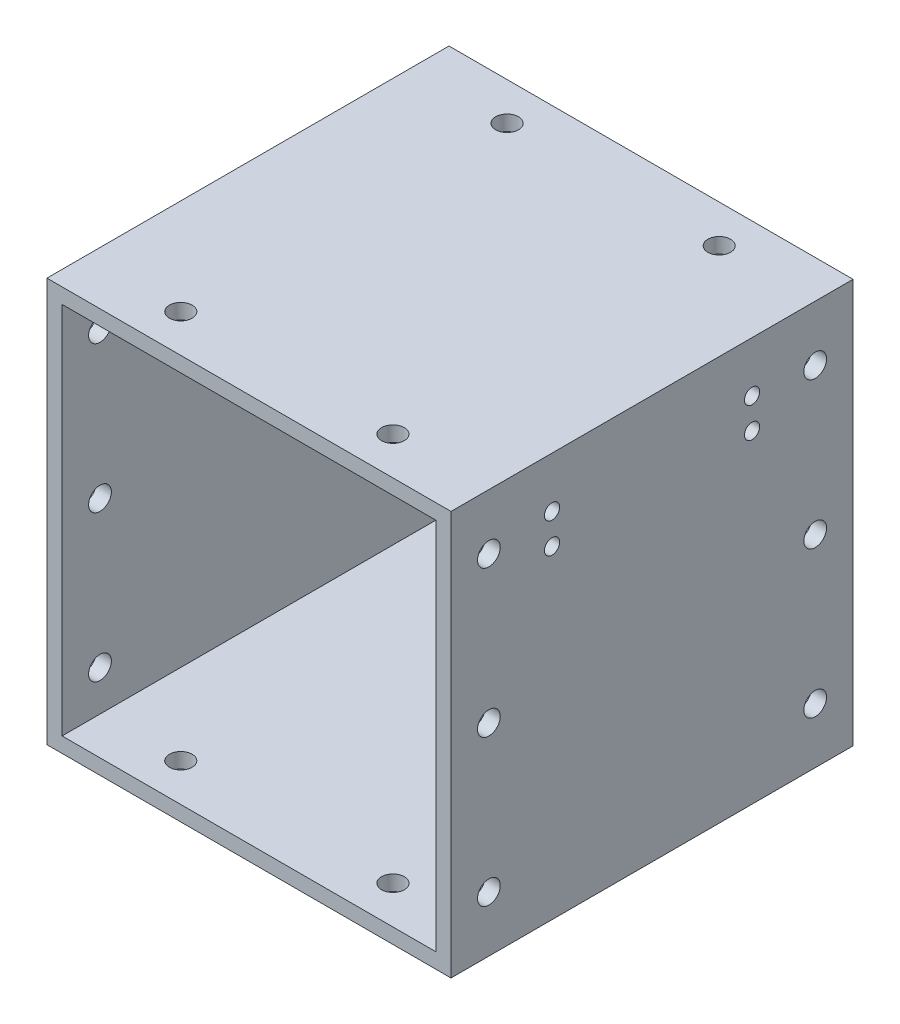
ISO-10303-21;
HEADER;
FILE_DESCRIPTION(('STEP AP214'),'2;1');
FILE_NAME('part.step','',(''),(''),'','','');
FILE_SCHEMA(('AUTOMOTIVE_DESIGN { 1 0 10303 214 1 1 1 1 }'));
ENDSEC;
DATA;
#1=APPLICATION_CONTEXT('core data for automotive mechanical design processes');
#2=APPLICATION_PROTOCOL_DEFINITION('international standard','automotive_design',2000,#1);
#3=PRODUCT_CONTEXT('',#1,'mechanical');
#4=PRODUCT('Part','Part','',(#3));
#5=PRODUCT_RELATED_PRODUCT_CATEGORY('part','',(#4));
#6=PRODUCT_DEFINITION_FORMATION('','',#4);
#7=PRODUCT_DEFINITION_CONTEXT('part definition',#1,'design');
#8=PRODUCT_DEFINITION('design','',#6,#7);
#9=PRODUCT_DEFINITION_SHAPE('','',#8);
#10=(LENGTH_UNIT() NAMED_UNIT(*) SI_UNIT(.MILLI.,.METRE.));
#11=(NAMED_UNIT(*) PLANE_ANGLE_UNIT() SI_UNIT($,.RADIAN.));
#12=(NAMED_UNIT(*) SI_UNIT($,.STERADIAN.) SOLID_ANGLE_UNIT());
#13=UNCERTAINTY_MEASURE_WITH_UNIT(LENGTH_MEASURE(1.E-05),#10,'distance_accuracy_value','');
#14=(GEOMETRIC_REPRESENTATION_CONTEXT(3) GLOBAL_UNCERTAINTY_ASSIGNED_CONTEXT((#13)) GLOBAL_UNIT_ASSIGNED_CONTEXT((#10,
#11,#12)) REPRESENTATION_CONTEXT('',''));
#15=CARTESIAN_POINT('',(0.,0.,0.));
#16=DIRECTION('',(0.,0.,1.));
#17=DIRECTION('',(1.,0.,0.));
#18=AXIS2_PLACEMENT_3D('',#15,#16,#17);
#19=CARTESIAN_POINT('',(40.,-40.,136.6));
#20=DIRECTION('',(-1.,0.,0.));
#21=DIRECTION('',(0.,0.,1.));
#22=AXIS2_PLACEMENT_3D('',#19,#20,#21);
#23=PLANE('',#22);
#24=CARTESIAN_POINT('',(40.,29.,64.5));
#25=DIRECTION('',(1.,0.,0.));
#26=DIRECTION('',(0.,0.,-1.));
#27=AXIS2_PLACEMENT_3D('',#24,#25,#26);
#28=CIRCLE('',#27,2.25);
#29=CARTESIAN_POINT('',(40.,29.,62.25));
#30=VERTEX_POINT('',#29);
#31=EDGE_CURVE('E412',#30,#30,#28,.T.);
#32=ORIENTED_EDGE('',*,*,#31,.F.);
#33=EDGE_LOOP('',(#32));
#34=FACE_BOUND('',#33,.T.);
#35=DIRECTION('',(0.,1.,0.));
#36=VECTOR('',#35,1.);
#37=CARTESIAN_POINT('',(40.,-40.,57.));
#38=LINE('',#37,#36);
#39=CARTESIAN_POINT('',(40.,-40.,57.));
#40=VERTEX_POINT('',#39);
#41=CARTESIAN_POINT('',(40.,40.,57.));
#42=VERTEX_POINT('',#41);
#43=EDGE_CURVE('E137',#40,#42,#38,.T.);
#44=ORIENTED_EDGE('',*,*,#43,.T.);
#45=DIRECTION('',(0.,0.,-1.));
#46=VECTOR('',#45,1.);
#47=CARTESIAN_POINT('',(40.,40.,136.6));
#48=LINE('',#47,#46);
#49=CARTESIAN_POINT('',(40.,40.,136.6));
#50=VERTEX_POINT('',#49);
#51=EDGE_CURVE('E11',#50,#42,#48,.T.);
#52=ORIENTED_EDGE('',*,*,#51,.F.);
#53=DIRECTION('',(0.,1.,0.));
#54=VECTOR('',#53,1.);
#55=CARTESIAN_POINT('',(40.,-40.,136.6));
#56=LINE('',#55,#54);
#57=CARTESIAN_POINT('',(40.,-40.,136.6));
#58=VERTEX_POINT('',#57);
#59=EDGE_CURVE('E172',#58,#50,#56,.T.);
#60=ORIENTED_EDGE('',*,*,#59,.F.);
#61=DIRECTION('',(0.,0.,-1.));
#62=VECTOR('',#61,1.);
#63=CARTESIAN_POINT('',(40.,-40.,136.6));
#64=LINE('',#63,#62);
#65=EDGE_CURVE('E186',#58,#40,#64,.T.);
#66=ORIENTED_EDGE('',*,*,#65,.T.);
#67=EDGE_LOOP('',(#44,#52,#60,#66));
#68=FACE_BOUND('',#67,.T.);
#69=CARTESIAN_POINT('',(40.,-29.,129.1));
#70=DIRECTION('',(1.,0.,0.));
#71=DIRECTION('',(0.,0.,-1.));
#72=AXIS2_PLACEMENT_3D('',#69,#70,#71);
#73=CIRCLE('',#72,2.25);
#74=CARTESIAN_POINT('',(40.,-29.,126.85));
#75=VERTEX_POINT('',#74);
#76=EDGE_CURVE('E322',#75,#75,#73,.T.);
#77=ORIENTED_EDGE('',*,*,#76,.F.);
#78=EDGE_LOOP('',(#77));
#79=FACE_BOUND('',#78,.T.);
#80=CARTESIAN_POINT('',(40.,0.,129.1));
#81=DIRECTION('',(1.,0.,0.));
#82=DIRECTION('',(0.,0.,-1.));
#83=AXIS2_PLACEMENT_3D('',#80,#81,#82);
#84=CIRCLE('',#83,2.25);
#85=CARTESIAN_POINT('',(40.,0.,126.85));
#86=VERTEX_POINT('',#85);
#87=EDGE_CURVE('E314',#86,#86,#84,.T.);
#88=ORIENTED_EDGE('',*,*,#87,.F.);
#89=EDGE_LOOP('',(#88));
#90=FACE_BOUND('',#89,.T.);
#91=CARTESIAN_POINT('',(40.,29.,129.1));
#92=DIRECTION('',(1.,0.,0.));
#93=DIRECTION('',(0.,0.,-1.));
#94=AXIS2_PLACEMENT_3D('',#91,#92,#93);
#95=CIRCLE('',#94,2.25);
#96=CARTESIAN_POINT('',(40.,29.,126.85));
#97=VERTEX_POINT('',#96);
#98=EDGE_CURVE('E306',#97,#97,#95,.T.);
#99=ORIENTED_EDGE('',*,*,#98,.F.);
#100=EDGE_LOOP('',(#99));
#101=FACE_BOUND('',#100,.T.);
#102=CARTESIAN_POINT('',(40.,0.,64.5));
#103=DIRECTION('',(1.,0.,0.));
#104=DIRECTION('',(0.,0.,-1.));
#105=AXIS2_PLACEMENT_3D('',#102,#103,#104);
#106=CIRCLE('',#105,2.25);
#107=CARTESIAN_POINT('',(40.,0.,62.25));
#108=VERTEX_POINT('',#107);
#109=EDGE_CURVE('E256',#108,#108,#106,.T.);
#110=ORIENTED_EDGE('',*,*,#109,.F.);
#111=EDGE_LOOP('',(#110));
#112=FACE_BOUND('',#111,.T.);
#113=CARTESIAN_POINT('',(40.,-29.,64.5));
#114=DIRECTION('',(1.,0.,0.));
#115=DIRECTION('',(0.,0.,-1.));
#116=AXIS2_PLACEMENT_3D('',#113,#114,#115);
#117=CIRCLE('',#116,2.25);
#118=CARTESIAN_POINT('',(40.,-29.,62.25));
#119=VERTEX_POINT('',#118);
#120=EDGE_CURVE('E422',#119,#119,#117,.T.);
#121=ORIENTED_EDGE('',*,*,#120,.F.);
#122=EDGE_LOOP('',(#121));
#123=FACE_BOUND('',#122,.T.);
#124=CARTESIAN_POINT('',(40.,30.,77.));
#125=DIRECTION('',(1.,0.,0.));
#126=DIRECTION('',(0.,0.,-1.));
#127=AXIS2_PLACEMENT_3D('',#124,#125,#126);
#128=CIRCLE('',#127,1.49999999999999);
#129=CARTESIAN_POINT('',(40.,30.,75.5));
#130=VERTEX_POINT('',#129);
#131=EDGE_CURVE('E425',#130,#130,#128,.T.);
#132=ORIENTED_EDGE('',*,*,#131,.F.);
#133=EDGE_LOOP('',(#132));
#134=FACE_BOUND('',#133,.T.);
#135=CARTESIAN_POINT('',(40.,24.,77.));
#136=DIRECTION('',(1.,0.,0.));
#137=DIRECTION('',(0.,0.,-1.));
#138=AXIS2_PLACEMENT_3D('',#135,#136,#137);
#139=CIRCLE('',#138,1.49999999999999);
#140=CARTESIAN_POINT('',(40.,24.,75.5));
#141=VERTEX_POINT('',#140);
#142=EDGE_CURVE('E453',#141,#141,#139,.T.);
#143=ORIENTED_EDGE('',*,*,#142,.F.);
#144=EDGE_LOOP('',(#143));
#145=FACE_BOUND('',#144,.T.);
#146=CARTESIAN_POINT('',(40.,30.,116.6));
#147=DIRECTION('',(1.,0.,0.));
#148=DIRECTION('',(0.,0.,-1.));
#149=AXIS2_PLACEMENT_3D('',#146,#147,#148);
#150=CIRCLE('',#149,1.49999999999999);
#151=CARTESIAN_POINT('',(40.,30.,115.1));
#152=VERTEX_POINT('',#151);
#153=EDGE_CURVE('E457',#152,#152,#150,.T.);
#154=ORIENTED_EDGE('',*,*,#153,.F.);
#155=EDGE_LOOP('',(#154));
#156=FACE_BOUND('',#155,.T.);
#157=CARTESIAN_POINT('',(40.,24.,116.6));
#158=DIRECTION('',(1.,0.,0.));
#159=DIRECTION('',(0.,0.,-1.));
#160=AXIS2_PLACEMENT_3D('',#157,#158,#159);
#161=CIRCLE('',#160,1.49999999999999);
#162=CARTESIAN_POINT('',(40.,24.,115.1));
#163=VERTEX_POINT('',#162);
#164=EDGE_CURVE('E460',#163,#163,#161,.T.);
#165=ORIENTED_EDGE('',*,*,#164,.F.);
#166=EDGE_LOOP('',(#165));
#167=FACE_BOUND('',#166,.T.);
#168=ADVANCED_FACE('F51',(#34,#68,#79,#90,#101,#112,#123,#134,#145,#156,#167),#23,.F.);
#169=CARTESIAN_POINT('',(-40.,40.,136.6));
#170=DIRECTION('',(0.,-1.,0.));
#171=DIRECTION('',(0.,0.,-1.));
#172=AXIS2_PLACEMENT_3D('',#169,#170,#171);
#173=PLANE('',#172);
#174=CARTESIAN_POINT('',(-21.,40.,129.1));
#175=DIRECTION('',(0.,1.,0.));
#176=DIRECTION('',(0.,0.,1.));
#177=AXIS2_PLACEMENT_3D('',#174,#175,#176);
#178=CIRCLE('',#177,2.25);
#179=CARTESIAN_POINT('',(-21.,40.,131.35));
#180=VERTEX_POINT('',#179);
#181=EDGE_CURVE('E330',#180,#180,#178,.T.);
#182=ORIENTED_EDGE('',*,*,#181,.F.);
#183=EDGE_LOOP('',(#182));
#184=FACE_BOUND('',#183,.T.);
#185=DIRECTION('',(-1.,0.,0.));
#186=VECTOR('',#185,1.);
#187=CARTESIAN_POINT('',(-40.,40.,57.));
#188=LINE('',#187,#186);
#189=CARTESIAN_POINT('',(-40.,40.,57.));
#190=VERTEX_POINT('',#189);
#191=EDGE_CURVE('E190',#42,#190,#188,.T.);
#192=ORIENTED_EDGE('',*,*,#191,.T.);
#193=DIRECTION('',(0.,0.,-1.));
#194=VECTOR('',#193,1.);
#195=CARTESIAN_POINT('',(-40.,40.,136.6));
#196=LINE('',#195,#194);
#197=CARTESIAN_POINT('',(-40.,40.,136.6));
#198=VERTEX_POINT('',#197);
#199=EDGE_CURVE('E59',#198,#190,#196,.T.);
#200=ORIENTED_EDGE('',*,*,#199,.F.);
#201=DIRECTION('',(-1.,0.,0.));
#202=VECTOR('',#201,1.);
#203=CARTESIAN_POINT('',(-40.,40.,136.6));
#204=LINE('',#203,#202);
#205=EDGE_CURVE('E176',#50,#198,#204,.T.);
#206=ORIENTED_EDGE('',*,*,#205,.F.);
#207=ORIENTED_EDGE('',*,*,#51,.T.);
#208=EDGE_LOOP('',(#192,#200,#206,#207));
#209=FACE_BOUND('',#208,.T.);
#210=CARTESIAN_POINT('',(21.,40.,129.1));
#211=DIRECTION('',(0.,1.,0.));
#212=DIRECTION('',(0.,0.,1.));
#213=AXIS2_PLACEMENT_3D('',#210,#211,#212);
#214=CIRCLE('',#213,2.25);
#215=CARTESIAN_POINT('',(21.,40.,131.35));
#216=VERTEX_POINT('',#215);
#217=EDGE_CURVE('E237',#216,#216,#214,.T.);
#218=ORIENTED_EDGE('',*,*,#217,.F.);
#219=EDGE_LOOP('',(#218));
#220=FACE_BOUND('',#219,.T.);
#221=CARTESIAN_POINT('',(-21.,40.,64.5));
#222=DIRECTION('',(0.,1.,0.));
#223=DIRECTION('',(0.,0.,1.));
#224=AXIS2_PLACEMENT_3D('',#221,#222,#223);
#225=CIRCLE('',#224,2.25);
#226=CARTESIAN_POINT('',(-21.,40.,66.75));
#227=VERTEX_POINT('',#226);
#228=EDGE_CURVE('E241',#227,#227,#225,.T.);
#229=ORIENTED_EDGE('',*,*,#228,.F.);
#230=EDGE_LOOP('',(#229));
#231=FACE_BOUND('',#230,.T.);
#232=CARTESIAN_POINT('',(21.,40.,64.5));
#233=DIRECTION('',(0.,1.,0.));
#234=DIRECTION('',(0.,0.,1.));
#235=AXIS2_PLACEMENT_3D('',#232,#233,#234);
#236=CIRCLE('',#235,2.25);
#237=CARTESIAN_POINT('',(21.,40.,66.75));
#238=VERTEX_POINT('',#237);
#239=EDGE_CURVE('E244',#238,#238,#236,.T.);
#240=ORIENTED_EDGE('',*,*,#239,.F.);
#241=EDGE_LOOP('',(#240));
#242=FACE_BOUND('',#241,.T.);
#243=ADVANCED_FACE('F230',(#184,#209,#220,#231,#242),#173,.F.);
#244=CARTESIAN_POINT('',(-40.,-40.,136.6));
#245=DIRECTION('',(1.,0.,0.));
#246=DIRECTION('',(0.,0.,-1.));
#247=AXIS2_PLACEMENT_3D('',#244,#245,#246);
#248=PLANE('',#247);
#249=DIRECTION('',(0.,-1.,0.));
#250=VECTOR('',#249,1.);
#251=CARTESIAN_POINT('',(-40.,-40.,57.));
#252=LINE('',#251,#250);
#253=CARTESIAN_POINT('',(-40.,-40.,57.));
#254=VERTEX_POINT('',#253);
#255=EDGE_CURVE('E193',#190,#254,#252,.T.);
#256=ORIENTED_EDGE('',*,*,#255,.T.);
#257=DIRECTION('',(0.,0.,-1.));
#258=VECTOR('',#257,1.);
#259=CARTESIAN_POINT('',(-40.,-40.,136.6));
#260=LINE('',#259,#258);
#261=CARTESIAN_POINT('',(-40.,-40.,136.6));
#262=VERTEX_POINT('',#261);
#263=EDGE_CURVE('E201',#262,#254,#260,.T.);
#264=ORIENTED_EDGE('',*,*,#263,.F.);
#265=DIRECTION('',(0.,-1.,0.));
#266=VECTOR('',#265,1.);
#267=CARTESIAN_POINT('',(-40.,-40.,136.6));
#268=LINE('',#267,#266);
#269=EDGE_CURVE('E180',#198,#262,#268,.T.);
#270=ORIENTED_EDGE('',*,*,#269,.F.);
#271=ORIENTED_EDGE('',*,*,#199,.T.);
#272=EDGE_LOOP('',(#256,#264,#270,#271));
#273=FACE_BOUND('',#272,.T.);
#274=CARTESIAN_POINT('',(-40.,29.,129.1));
#275=DIRECTION('',(-1.,0.,0.));
#276=DIRECTION('',(0.,0.,1.));
#277=AXIS2_PLACEMENT_3D('',#274,#275,#276);
#278=CIRCLE('',#277,2.25);
#279=CARTESIAN_POINT('',(-40.,29.,131.35));
#280=VERTEX_POINT('',#279);
#281=EDGE_CURVE('E376',#280,#280,#278,.T.);
#282=ORIENTED_EDGE('',*,*,#281,.F.);
#283=EDGE_LOOP('',(#282));
#284=FACE_BOUND('',#283,.T.);
#285=CARTESIAN_POINT('',(-40.,0.,129.1));
#286=DIRECTION('',(-1.,0.,0.));
#287=DIRECTION('',(0.,0.,1.));
#288=AXIS2_PLACEMENT_3D('',#285,#286,#287);
#289=CIRCLE('',#288,2.25);
#290=CARTESIAN_POINT('',(-40.,0.,131.35));
#291=VERTEX_POINT('',#290);
#292=EDGE_CURVE('E368',#291,#291,#289,.T.);
#293=ORIENTED_EDGE('',*,*,#292,.F.);
#294=EDGE_LOOP('',(#293));
#295=FACE_BOUND('',#294,.T.);
#296=CARTESIAN_POINT('',(-40.,-29.,129.1));
#297=DIRECTION('',(-1.,0.,0.));
#298=DIRECTION('',(0.,0.,1.));
#299=AXIS2_PLACEMENT_3D('',#296,#297,#298);
#300=CIRCLE('',#299,2.25);
#301=CARTESIAN_POINT('',(-40.,-29.,131.35));
#302=VERTEX_POINT('',#301);
#303=EDGE_CURVE('E344',#302,#302,#300,.T.);
#304=ORIENTED_EDGE('',*,*,#303,.F.);
#305=EDGE_LOOP('',(#304));
#306=FACE_BOUND('',#305,.T.);
#307=CARTESIAN_POINT('',(-40.,-29.,64.5));
#308=DIRECTION('',(-1.,0.,0.));
#309=DIRECTION('',(0.,0.,1.));
#310=AXIS2_PLACEMENT_3D('',#307,#308,#309);
#311=CIRCLE('',#310,2.25);
#312=CARTESIAN_POINT('',(-40.,-29.,66.75));
#313=VERTEX_POINT('',#312);
#314=EDGE_CURVE('E282',#313,#313,#311,.T.);
#315=ORIENTED_EDGE('',*,*,#314,.F.);
#316=EDGE_LOOP('',(#315));
#317=FACE_BOUND('',#316,.T.);
#318=CARTESIAN_POINT('',(-40.,0.,64.5));
#319=DIRECTION('',(-1.,0.,0.));
#320=DIRECTION('',(0.,0.,1.));
#321=AXIS2_PLACEMENT_3D('',#318,#319,#320);
#322=CIRCLE('',#321,2.25);
#323=CARTESIAN_POINT('',(-40.,0.,66.75));
#324=VERTEX_POINT('',#323);
#325=EDGE_CURVE('E274',#324,#324,#322,.T.);
#326=ORIENTED_EDGE('',*,*,#325,.F.);
#327=EDGE_LOOP('',(#326));
#328=FACE_BOUND('',#327,.T.);
#329=CARTESIAN_POINT('',(-40.,29.,64.5));
#330=DIRECTION('',(-1.,0.,0.));
#331=DIRECTION('',(0.,0.,1.));
#332=AXIS2_PLACEMENT_3D('',#329,#330,#331);
#333=CIRCLE('',#332,2.25);
#334=CARTESIAN_POINT('',(-40.,29.,66.75));
#335=VERTEX_POINT('',#334);
#336=EDGE_CURVE('E266',#335,#335,#333,.T.);
#337=ORIENTED_EDGE('',*,*,#336,.F.);
#338=EDGE_LOOP('',(#337));
#339=FACE_BOUND('',#338,.T.);
#340=ADVANCED_FACE('F211',(#273,#284,#295,#306,#317,#328,#339),#248,.F.);
#341=CARTESIAN_POINT('',(-40.,-40.,136.6));
#342=DIRECTION('',(0.,1.,0.));
#343=DIRECTION('',(0.,0.,1.));
#344=AXIS2_PLACEMENT_3D('',#341,#342,#343);
#345=PLANE('',#344);
#346=DIRECTION('',(1.,0.,0.));
#347=VECTOR('',#346,1.);
#348=CARTESIAN_POINT('',(-40.,-40.,57.));
#349=LINE('',#348,#347);
#350=EDGE_CURVE('E177',#254,#40,#349,.T.);
#351=ORIENTED_EDGE('',*,*,#350,.T.);
#352=ORIENTED_EDGE('',*,*,#65,.F.);
#353=DIRECTION('',(1.,0.,0.));
#354=VECTOR('',#353,1.);
#355=CARTESIAN_POINT('',(-40.,-40.,136.6));
#356=LINE('',#355,#354);
#357=EDGE_CURVE('E183',#262,#58,#356,.T.);
#358=ORIENTED_EDGE('',*,*,#357,.F.);
#359=ORIENTED_EDGE('',*,*,#263,.T.);
#360=EDGE_LOOP('',(#351,#352,#358,#359));
#361=FACE_BOUND('',#360,.T.);
#362=CARTESIAN_POINT('',(21.,-40.,129.1));
#363=DIRECTION('',(0.,-1.,0.));
#364=DIRECTION('',(0.,0.,-1.));
#365=AXIS2_PLACEMENT_3D('',#362,#363,#364);
#366=CIRCLE('',#365,2.25);
#367=CARTESIAN_POINT('',(21.,-40.,126.85));
#368=VERTEX_POINT('',#367);
#369=EDGE_CURVE('E360',#368,#368,#366,.T.);
#370=ORIENTED_EDGE('',*,*,#369,.F.);
#371=EDGE_LOOP('',(#370));
#372=FACE_BOUND('',#371,.T.);
#373=CARTESIAN_POINT('',(-21.,-40.,129.1));
#374=DIRECTION('',(0.,-1.,0.));
#375=DIRECTION('',(0.,0.,-1.));
#376=AXIS2_PLACEMENT_3D('',#373,#374,#375);
#377=CIRCLE('',#376,2.25);
#378=CARTESIAN_POINT('',(-21.,-40.,126.85));
#379=VERTEX_POINT('',#378);
#380=EDGE_CURVE('E352',#379,#379,#377,.T.);
#381=ORIENTED_EDGE('',*,*,#380,.F.);
#382=EDGE_LOOP('',(#381));
#383=FACE_BOUND('',#382,.T.);
#384=CARTESIAN_POINT('',(-21.,-40.,64.5));
#385=DIRECTION('',(0.,-1.,0.));
#386=DIRECTION('',(0.,0.,-1.));
#387=AXIS2_PLACEMENT_3D('',#384,#385,#386);
#388=CIRCLE('',#387,2.25);
#389=CARTESIAN_POINT('',(-21.,-40.,62.25));
#390=VERTEX_POINT('',#389);
#391=EDGE_CURVE('E298',#390,#390,#388,.T.);
#392=ORIENTED_EDGE('',*,*,#391,.F.);
#393=EDGE_LOOP('',(#392));
#394=FACE_BOUND('',#393,.T.);
#395=CARTESIAN_POINT('',(21.,-40.,64.5));
#396=DIRECTION('',(0.,-1.,0.));
#397=DIRECTION('',(0.,0.,-1.));
#398=AXIS2_PLACEMENT_3D('',#395,#396,#397);
#399=CIRCLE('',#398,2.25);
#400=CARTESIAN_POINT('',(21.,-40.,62.25));
#401=VERTEX_POINT('',#400);
#402=EDGE_CURVE('E290',#401,#401,#399,.T.);
#403=ORIENTED_EDGE('',*,*,#402,.F.);
#404=EDGE_LOOP('',(#403));
#405=FACE_BOUND('',#404,.T.);
#406=ADVANCED_FACE('F222',(#361,#372,#383,#394,#405),#345,.F.);
#407=CARTESIAN_POINT('',(0.,0.,136.6));
#408=DIRECTION('',(0.,0.,-1.));
#409=DIRECTION('',(-1.,0.,0.));
#410=AXIS2_PLACEMENT_3D('',#407,#408,#409);
#411=PLANE('',#410);
#412=ORIENTED_EDGE('',*,*,#59,.T.);
#413=ORIENTED_EDGE('',*,*,#205,.T.);
#414=ORIENTED_EDGE('',*,*,#269,.T.);
#415=ORIENTED_EDGE('',*,*,#357,.T.);
#416=EDGE_LOOP('',(#412,#413,#414,#415));
#417=FACE_BOUND('',#416,.T.);
#418=DIRECTION('',(1.,0.,0.));
#419=VECTOR('',#418,1.);
#420=CARTESIAN_POINT('',(-37.,-37.,136.6));
#421=LINE('',#420,#419);
#422=CARTESIAN_POINT('',(-37.,-37.,136.6));
#423=VERTEX_POINT('',#422);
#424=CARTESIAN_POINT('',(37.,-37.,136.6));
#425=VERTEX_POINT('',#424);
#426=EDGE_CURVE('E119',#423,#425,#421,.T.);
#427=ORIENTED_EDGE('',*,*,#426,.F.);
#428=DIRECTION('',(0.,-1.,0.));
#429=VECTOR('',#428,1.);
#430=CARTESIAN_POINT('',(-37.,-37.,136.6));
#431=LINE('',#430,#429);
#432=CARTESIAN_POINT('',(-37.,37.,136.6));
#433=VERTEX_POINT('',#432);
#434=EDGE_CURVE('E148',#433,#423,#431,.T.);
#435=ORIENTED_EDGE('',*,*,#434,.F.);
#436=DIRECTION('',(-1.,0.,0.));
#437=VECTOR('',#436,1.);
#438=CARTESIAN_POINT('',(-37.,37.,136.6));
#439=LINE('',#438,#437);
#440=CARTESIAN_POINT('',(37.,37.,136.6));
#441=VERTEX_POINT('',#440);
#442=EDGE_CURVE('E142',#441,#433,#439,.T.);
#443=ORIENTED_EDGE('',*,*,#442,.F.);
#444=DIRECTION('',(0.,1.,0.));
#445=VECTOR('',#444,1.);
#446=CARTESIAN_POINT('',(37.,-37.,136.6));
#447=LINE('',#446,#445);
#448=EDGE_CURVE('E128',#425,#441,#447,.T.);
#449=ORIENTED_EDGE('',*,*,#448,.F.);
#450=EDGE_LOOP('',(#427,#435,#443,#449));
#451=FACE_BOUND('',#450,.T.);
#452=ADVANCED_FACE('F141',(#417,#451),#411,.F.);
#453=CARTESIAN_POINT('',(0.,0.,57.));
#454=DIRECTION('',(0.,0.,-1.));
#455=DIRECTION('',(-1.,0.,0.));
#456=AXIS2_PLACEMENT_3D('',#453,#454,#455);
#457=PLANE('',#456);
#458=ORIENTED_EDGE('',*,*,#43,.F.);
#459=ORIENTED_EDGE('',*,*,#350,.F.);
#460=ORIENTED_EDGE('',*,*,#255,.F.);
#461=ORIENTED_EDGE('',*,*,#191,.F.);
#462=EDGE_LOOP('',(#458,#459,#460,#461));
#463=FACE_BOUND('',#462,.T.);
#464=DIRECTION('',(0.,-1.,0.));
#465=VECTOR('',#464,1.);
#466=CARTESIAN_POINT('',(-37.,-37.,57.));
#467=LINE('',#466,#465);
#468=CARTESIAN_POINT('',(-37.,37.,57.));
#469=VERTEX_POINT('',#468);
#470=CARTESIAN_POINT('',(-37.,-37.,57.));
#471=VERTEX_POINT('',#470);
#472=EDGE_CURVE('E129',#469,#471,#467,.T.);
#473=ORIENTED_EDGE('',*,*,#472,.T.);
#474=DIRECTION('',(1.,0.,0.));
#475=VECTOR('',#474,1.);
#476=CARTESIAN_POINT('',(-37.,-37.,57.));
#477=LINE('',#476,#475);
#478=CARTESIAN_POINT('',(37.,-37.,57.));
#479=VERTEX_POINT('',#478);
#480=EDGE_CURVE('E76',#471,#479,#477,.T.);
#481=ORIENTED_EDGE('',*,*,#480,.T.);
#482=DIRECTION('',(0.,1.,0.));
#483=VECTOR('',#482,1.);
#484=CARTESIAN_POINT('',(37.,-37.,57.));
#485=LINE('',#484,#483);
#486=CARTESIAN_POINT('',(37.,37.,57.));
#487=VERTEX_POINT('',#486);
#488=EDGE_CURVE('E135',#479,#487,#485,.T.);
#489=ORIENTED_EDGE('',*,*,#488,.T.);
#490=DIRECTION('',(-1.,0.,0.));
#491=VECTOR('',#490,1.);
#492=CARTESIAN_POINT('',(-37.,37.,57.));
#493=LINE('',#492,#491);
#494=EDGE_CURVE('E159',#487,#469,#493,.T.);
#495=ORIENTED_EDGE('',*,*,#494,.T.);
#496=EDGE_LOOP('',(#473,#481,#489,#495));
#497=FACE_BOUND('',#496,.T.);
#498=ADVANCED_FACE('F218',(#463,#497),#457,.T.);
#499=CARTESIAN_POINT('',(-37.,-37.,136.6));
#500=DIRECTION('',(0.,1.,0.));
#501=DIRECTION('',(0.,0.,1.));
#502=AXIS2_PLACEMENT_3D('',#499,#500,#501);
#503=PLANE('',#502);
#504=CARTESIAN_POINT('',(21.,-37.,64.5));
#505=DIRECTION('',(0.,1.,0.));
#506=DIRECTION('',(0.,0.,1.));
#507=AXIS2_PLACEMENT_3D('',#504,#505,#506);
#508=CIRCLE('',#507,2.25);
#509=CARTESIAN_POINT('',(21.,-37.,66.75));
#510=VERTEX_POINT('',#509);
#511=EDGE_CURVE('E294',#510,#510,#508,.T.);
#512=ORIENTED_EDGE('',*,*,#511,.F.);
#513=EDGE_LOOP('',(#512));
#514=FACE_BOUND('',#513,.T.);
#515=CARTESIAN_POINT('',(-21.,-37.,64.5));
#516=DIRECTION('',(0.,1.,0.));
#517=DIRECTION('',(0.,0.,1.));
#518=AXIS2_PLACEMENT_3D('',#515,#516,#517);
#519=CIRCLE('',#518,2.25);
#520=CARTESIAN_POINT('',(-21.,-37.,66.75));
#521=VERTEX_POINT('',#520);
#522=EDGE_CURVE('E302',#521,#521,#519,.T.);
#523=ORIENTED_EDGE('',*,*,#522,.F.);
#524=EDGE_LOOP('',(#523));
#525=FACE_BOUND('',#524,.T.);
#526=CARTESIAN_POINT('',(-21.,-37.,129.1));
#527=DIRECTION('',(0.,1.,0.));
#528=DIRECTION('',(0.,0.,1.));
#529=AXIS2_PLACEMENT_3D('',#526,#527,#528);
#530=CIRCLE('',#529,2.25);
#531=CARTESIAN_POINT('',(-21.,-37.,131.35));
#532=VERTEX_POINT('',#531);
#533=EDGE_CURVE('E356',#532,#532,#530,.T.);
#534=ORIENTED_EDGE('',*,*,#533,.F.);
#535=EDGE_LOOP('',(#534));
#536=FACE_BOUND('',#535,.T.);
#537=CARTESIAN_POINT('',(21.,-37.,129.1));
#538=DIRECTION('',(0.,1.,0.));
#539=DIRECTION('',(0.,0.,1.));
#540=AXIS2_PLACEMENT_3D('',#537,#538,#539);
#541=CIRCLE('',#540,2.25);
#542=CARTESIAN_POINT('',(21.,-37.,131.35));
#543=VERTEX_POINT('',#542);
#544=EDGE_CURVE('E364',#543,#543,#541,.T.);
#545=ORIENTED_EDGE('',*,*,#544,.F.);
#546=EDGE_LOOP('',(#545));
#547=FACE_BOUND('',#546,.T.);
#548=ORIENTED_EDGE('',*,*,#480,.F.);
#549=DIRECTION('',(0.,0.,-1.));
#550=VECTOR('',#549,1.);
#551=CARTESIAN_POINT('',(-37.,-37.,136.6));
#552=LINE('',#551,#550);
#553=EDGE_CURVE('E123',#423,#471,#552,.T.);
#554=ORIENTED_EDGE('',*,*,#553,.F.);
#555=ORIENTED_EDGE('',*,*,#426,.T.);
#556=DIRECTION('',(0.,0.,-1.));
#557=VECTOR('',#556,1.);
#558=CARTESIAN_POINT('',(37.,-37.,136.6));
#559=LINE('',#558,#557);
#560=EDGE_CURVE('E122',#425,#479,#559,.T.);
#561=ORIENTED_EDGE('',*,*,#560,.T.);
#562=EDGE_LOOP('',(#548,#554,#555,#561));
#563=FACE_BOUND('',#562,.T.);
#564=ADVANCED_FACE('F121',(#514,#525,#536,#547,#563),#503,.T.);
#565=CARTESIAN_POINT('',(37.,-37.,136.6));
#566=DIRECTION('',(-1.,0.,0.));
#567=DIRECTION('',(0.,-1.,0.));
#568=AXIS2_PLACEMENT_3D('',#565,#566,#567);
#569=PLANE('',#568);
#570=CARTESIAN_POINT('',(37.,24.,116.6));
#571=DIRECTION('',(-1.,0.,0.));
#572=DIRECTION('',(0.,-1.,0.));
#573=AXIS2_PLACEMENT_3D('',#570,#571,#572);
#574=CIRCLE('',#573,1.49999999999999);
#575=CARTESIAN_POINT('',(37.,22.5,116.6));
#576=VERTEX_POINT('',#575);
#577=EDGE_CURVE('E463',#576,#576,#574,.T.);
#578=ORIENTED_EDGE('',*,*,#577,.F.);
#579=EDGE_LOOP('',(#578));
#580=FACE_BOUND('',#579,.T.);
#581=CARTESIAN_POINT('',(37.,30.,116.6));
#582=DIRECTION('',(-1.,0.,0.));
#583=DIRECTION('',(0.,-1.,0.));
#584=AXIS2_PLACEMENT_3D('',#581,#582,#583);
#585=CIRCLE('',#584,1.49999999999999);
#586=CARTESIAN_POINT('',(37.,28.5,116.6));
#587=VERTEX_POINT('',#586);
#588=EDGE_CURVE('E472',#587,#587,#585,.T.);
#589=ORIENTED_EDGE('',*,*,#588,.F.);
#590=EDGE_LOOP('',(#589));
#591=FACE_BOUND('',#590,.T.);
#592=CARTESIAN_POINT('',(37.,24.,77.));
#593=DIRECTION('',(-1.,0.,0.));
#594=DIRECTION('',(0.,-1.,0.));
#595=AXIS2_PLACEMENT_3D('',#592,#593,#594);
#596=CIRCLE('',#595,1.49999999999999);
#597=CARTESIAN_POINT('',(37.,22.5,77.));
#598=VERTEX_POINT('',#597);
#599=EDGE_CURVE('E478',#598,#598,#596,.T.);
#600=ORIENTED_EDGE('',*,*,#599,.F.);
#601=EDGE_LOOP('',(#600));
#602=FACE_BOUND('',#601,.T.);
#603=CARTESIAN_POINT('',(37.,30.,77.));
#604=DIRECTION('',(-1.,0.,0.));
#605=DIRECTION('',(0.,-1.,0.));
#606=AXIS2_PLACEMENT_3D('',#603,#604,#605);
#607=CIRCLE('',#606,1.49999999999999);
#608=CARTESIAN_POINT('',(37.,28.5,77.));
#609=VERTEX_POINT('',#608);
#610=EDGE_CURVE('E416',#609,#609,#607,.T.);
#611=ORIENTED_EDGE('',*,*,#610,.F.);
#612=EDGE_LOOP('',(#611));
#613=FACE_BOUND('',#612,.T.);
#614=CARTESIAN_POINT('',(37.,29.,64.5));
#615=DIRECTION('',(-1.,0.,0.));
#616=DIRECTION('',(0.,-1.,0.));
#617=AXIS2_PLACEMENT_3D('',#614,#615,#616);
#618=CIRCLE('',#617,2.25);
#619=CARTESIAN_POINT('',(37.,26.75,64.5));
#620=VERTEX_POINT('',#619);
#621=EDGE_CURVE('E415',#620,#620,#618,.T.);
#622=ORIENTED_EDGE('',*,*,#621,.F.);
#623=EDGE_LOOP('',(#622));
#624=FACE_BOUND('',#623,.T.);
#625=CARTESIAN_POINT('',(37.,-29.,64.5));
#626=DIRECTION('',(-1.,0.,0.));
#627=DIRECTION('',(0.,-1.,0.));
#628=AXIS2_PLACEMENT_3D('',#625,#626,#627);
#629=CIRCLE('',#628,2.25);
#630=CARTESIAN_POINT('',(37.,-31.25,64.5));
#631=VERTEX_POINT('',#630);
#632=EDGE_CURVE('E432',#631,#631,#629,.T.);
#633=ORIENTED_EDGE('',*,*,#632,.F.);
#634=EDGE_LOOP('',(#633));
#635=FACE_BOUND('',#634,.T.);
#636=CARTESIAN_POINT('',(37.,0.,64.5));
#637=DIRECTION('',(-1.,0.,0.));
#638=DIRECTION('',(0.,-1.,0.));
#639=AXIS2_PLACEMENT_3D('',#636,#637,#638);
#640=CIRCLE('',#639,2.25);
#641=CARTESIAN_POINT('',(37.,-2.25,64.5));
#642=VERTEX_POINT('',#641);
#643=EDGE_CURVE('E248',#642,#642,#640,.T.);
#644=ORIENTED_EDGE('',*,*,#643,.F.);
#645=EDGE_LOOP('',(#644));
#646=FACE_BOUND('',#645,.T.);
#647=CARTESIAN_POINT('',(37.,29.,129.1));
#648=DIRECTION('',(-1.,0.,0.));
#649=DIRECTION('',(0.,-1.,0.));
#650=AXIS2_PLACEMENT_3D('',#647,#648,#649);
#651=CIRCLE('',#650,2.25);
#652=CARTESIAN_POINT('',(37.,26.75,129.1));
#653=VERTEX_POINT('',#652);
#654=EDGE_CURVE('E310',#653,#653,#651,.T.);
#655=ORIENTED_EDGE('',*,*,#654,.F.);
#656=EDGE_LOOP('',(#655));
#657=FACE_BOUND('',#656,.T.);
#658=CARTESIAN_POINT('',(37.,0.,129.1));
#659=DIRECTION('',(-1.,0.,0.));
#660=DIRECTION('',(0.,-1.,0.));
#661=AXIS2_PLACEMENT_3D('',#658,#659,#660);
#662=CIRCLE('',#661,2.25);
#663=CARTESIAN_POINT('',(37.,-2.25,129.1));
#664=VERTEX_POINT('',#663);
#665=EDGE_CURVE('E318',#664,#664,#662,.T.);
#666=ORIENTED_EDGE('',*,*,#665,.F.);
#667=EDGE_LOOP('',(#666));
#668=FACE_BOUND('',#667,.T.);
#669=CARTESIAN_POINT('',(37.,-29.,129.1));
#670=DIRECTION('',(-1.,0.,0.));
#671=DIRECTION('',(0.,-1.,0.));
#672=AXIS2_PLACEMENT_3D('',#669,#670,#671);
#673=CIRCLE('',#672,2.25);
#674=CARTESIAN_POINT('',(37.,-31.25,129.1));
#675=VERTEX_POINT('',#674);
#676=EDGE_CURVE('E326',#675,#675,#673,.T.);
#677=ORIENTED_EDGE('',*,*,#676,.F.);
#678=EDGE_LOOP('',(#677));
#679=FACE_BOUND('',#678,.T.);
#680=ORIENTED_EDGE('',*,*,#488,.F.);
#681=ORIENTED_EDGE('',*,*,#560,.F.);
#682=ORIENTED_EDGE('',*,*,#448,.T.);
#683=DIRECTION('',(0.,0.,-1.));
#684=VECTOR('',#683,1.);
#685=CARTESIAN_POINT('',(37.,37.,136.6));
#686=LINE('',#685,#684);
#687=EDGE_CURVE('E138',#441,#487,#686,.T.);
#688=ORIENTED_EDGE('',*,*,#687,.T.);
#689=EDGE_LOOP('',(#680,#681,#682,#688));
#690=FACE_BOUND('',#689,.T.);
#691=ADVANCED_FACE('F132',(#580,#591,#602,#613,#624,#635,#646,#657,#668,#679,#690),#569,.T.);
#692=CARTESIAN_POINT('',(-37.,37.,136.6));
#693=DIRECTION('',(0.,-1.,0.));
#694=DIRECTION('',(1.,0.,0.));
#695=AXIS2_PLACEMENT_3D('',#692,#693,#694);
#696=PLANE('',#695);
#697=CARTESIAN_POINT('',(21.,37.,64.5));
#698=DIRECTION('',(0.,-1.,0.));
#699=DIRECTION('',(1.,0.,0.));
#700=AXIS2_PLACEMENT_3D('',#697,#698,#699);
#701=CIRCLE('',#700,2.25);
#702=CARTESIAN_POINT('',(23.25,37.,64.5));
#703=VERTEX_POINT('',#702);
#704=EDGE_CURVE('E247',#703,#703,#701,.T.);
#705=ORIENTED_EDGE('',*,*,#704,.F.);
#706=EDGE_LOOP('',(#705));
#707=FACE_BOUND('',#706,.T.);
#708=CARTESIAN_POINT('',(-21.,37.,64.5));
#709=DIRECTION('',(0.,-1.,0.));
#710=DIRECTION('',(1.,0.,0.));
#711=AXIS2_PLACEMENT_3D('',#708,#709,#710);
#712=CIRCLE('',#711,2.25);
#713=CARTESIAN_POINT('',(-18.75,37.,64.5));
#714=VERTEX_POINT('',#713);
#715=EDGE_CURVE('E262',#714,#714,#712,.T.);
#716=ORIENTED_EDGE('',*,*,#715,.F.);
#717=EDGE_LOOP('',(#716));
#718=FACE_BOUND('',#717,.T.);
#719=CARTESIAN_POINT('',(-21.,37.,129.1));
#720=DIRECTION('',(0.,-1.,0.));
#721=DIRECTION('',(1.,0.,0.));
#722=AXIS2_PLACEMENT_3D('',#719,#720,#721);
#723=CIRCLE('',#722,2.25);
#724=CARTESIAN_POINT('',(-18.75,37.,129.1));
#725=VERTEX_POINT('',#724);
#726=EDGE_CURVE('E334',#725,#725,#723,.T.);
#727=ORIENTED_EDGE('',*,*,#726,.F.);
#728=EDGE_LOOP('',(#727));
#729=FACE_BOUND('',#728,.T.);
#730=CARTESIAN_POINT('',(21.,37.,129.1));
#731=DIRECTION('',(0.,-1.,0.));
#732=DIRECTION('',(1.,0.,0.));
#733=AXIS2_PLACEMENT_3D('',#730,#731,#732);
#734=CIRCLE('',#733,2.25);
#735=CARTESIAN_POINT('',(23.25,37.,129.1));
#736=VERTEX_POINT('',#735);
#737=EDGE_CURVE('E340',#736,#736,#734,.T.);
#738=ORIENTED_EDGE('',*,*,#737,.F.);
#739=EDGE_LOOP('',(#738));
#740=FACE_BOUND('',#739,.T.);
#741=ORIENTED_EDGE('',*,*,#494,.F.);
#742=ORIENTED_EDGE('',*,*,#687,.F.);
#743=ORIENTED_EDGE('',*,*,#442,.T.);
#744=DIRECTION('',(0.,0.,-1.));
#745=VECTOR('',#744,1.);
#746=CARTESIAN_POINT('',(-37.,37.,136.6));
#747=LINE('',#746,#745);
#748=EDGE_CURVE('E66',#433,#469,#747,.T.);
#749=ORIENTED_EDGE('',*,*,#748,.T.);
#750=EDGE_LOOP('',(#741,#742,#743,#749));
#751=FACE_BOUND('',#750,.T.);
#752=ADVANCED_FACE('F388',(#707,#718,#729,#740,#751),#696,.T.);
#753=CARTESIAN_POINT('',(-37.,-37.,136.6));
#754=DIRECTION('',(1.,0.,0.));
#755=DIRECTION('',(0.,0.,-1.));
#756=AXIS2_PLACEMENT_3D('',#753,#754,#755);
#757=PLANE('',#756);
#758=CARTESIAN_POINT('',(-37.,29.,64.5));
#759=DIRECTION('',(1.,0.,0.));
#760=DIRECTION('',(0.,0.,-1.));
#761=AXIS2_PLACEMENT_3D('',#758,#759,#760);
#762=CIRCLE('',#761,2.25);
#763=CARTESIAN_POINT('',(-37.,29.,62.25));
#764=VERTEX_POINT('',#763);
#765=EDGE_CURVE('E270',#764,#764,#762,.T.);
#766=ORIENTED_EDGE('',*,*,#765,.F.);
#767=EDGE_LOOP('',(#766));
#768=FACE_BOUND('',#767,.T.);
#769=CARTESIAN_POINT('',(-37.,0.,64.5));
#770=DIRECTION('',(1.,0.,0.));
#771=DIRECTION('',(0.,0.,-1.));
#772=AXIS2_PLACEMENT_3D('',#769,#770,#771);
#773=CIRCLE('',#772,2.25);
#774=CARTESIAN_POINT('',(-37.,0.,62.25));
#775=VERTEX_POINT('',#774);
#776=EDGE_CURVE('E278',#775,#775,#773,.T.);
#777=ORIENTED_EDGE('',*,*,#776,.F.);
#778=EDGE_LOOP('',(#777));
#779=FACE_BOUND('',#778,.T.);
#780=CARTESIAN_POINT('',(-37.,-29.,64.5));
#781=DIRECTION('',(1.,0.,0.));
#782=DIRECTION('',(0.,0.,-1.));
#783=AXIS2_PLACEMENT_3D('',#780,#781,#782);
#784=CIRCLE('',#783,2.25);
#785=CARTESIAN_POINT('',(-37.,-29.,62.25));
#786=VERTEX_POINT('',#785);
#787=EDGE_CURVE('E286',#786,#786,#784,.T.);
#788=ORIENTED_EDGE('',*,*,#787,.F.);
#789=EDGE_LOOP('',(#788));
#790=FACE_BOUND('',#789,.T.);
#791=CARTESIAN_POINT('',(-37.,-29.,129.1));
#792=DIRECTION('',(1.,0.,0.));
#793=DIRECTION('',(0.,0.,-1.));
#794=AXIS2_PLACEMENT_3D('',#791,#792,#793);
#795=CIRCLE('',#794,2.25);
#796=CARTESIAN_POINT('',(-37.,-29.,126.85));
#797=VERTEX_POINT('',#796);
#798=EDGE_CURVE('E348',#797,#797,#795,.T.);
#799=ORIENTED_EDGE('',*,*,#798,.F.);
#800=EDGE_LOOP('',(#799));
#801=FACE_BOUND('',#800,.T.);
#802=CARTESIAN_POINT('',(-37.,0.,129.1));
#803=DIRECTION('',(1.,0.,0.));
#804=DIRECTION('',(0.,0.,-1.));
#805=AXIS2_PLACEMENT_3D('',#802,#803,#804);
#806=CIRCLE('',#805,2.25);
#807=CARTESIAN_POINT('',(-37.,0.,126.85));
#808=VERTEX_POINT('',#807);
#809=EDGE_CURVE('E372',#808,#808,#806,.T.);
#810=ORIENTED_EDGE('',*,*,#809,.F.);
#811=EDGE_LOOP('',(#810));
#812=FACE_BOUND('',#811,.T.);
#813=CARTESIAN_POINT('',(-37.,29.,129.1));
#814=DIRECTION('',(1.,0.,0.));
#815=DIRECTION('',(0.,0.,-1.));
#816=AXIS2_PLACEMENT_3D('',#813,#814,#815);
#817=CIRCLE('',#816,2.25);
#818=CARTESIAN_POINT('',(-37.,29.,126.85));
#819=VERTEX_POINT('',#818);
#820=EDGE_CURVE('E156',#819,#819,#817,.T.);
#821=ORIENTED_EDGE('',*,*,#820,.F.);
#822=EDGE_LOOP('',(#821));
#823=FACE_BOUND('',#822,.T.);
#824=ORIENTED_EDGE('',*,*,#472,.F.);
#825=ORIENTED_EDGE('',*,*,#748,.F.);
#826=ORIENTED_EDGE('',*,*,#434,.T.);
#827=ORIENTED_EDGE('',*,*,#553,.T.);
#828=EDGE_LOOP('',(#824,#825,#826,#827));
#829=FACE_BOUND('',#828,.T.);
#830=ADVANCED_FACE('F386',(#768,#779,#790,#801,#812,#823,#829),#757,.T.);
#831=CARTESIAN_POINT('',(-40.,29.,129.1));
#832=DIRECTION('',(-1.,0.,0.));
#833=DIRECTION('',(0.,0.,1.));
#834=AXIS2_PLACEMENT_3D('',#831,#832,#833);
#835=CYLINDRICAL_SURFACE('',#834,2.25);
#836=ORIENTED_EDGE('',*,*,#281,.T.);
#837=EDGE_LOOP('',(#836));
#838=FACE_BOUND('',#837,.T.);
#839=ORIENTED_EDGE('',*,*,#820,.T.);
#840=EDGE_LOOP('',(#839));
#841=FACE_BOUND('',#840,.T.);
#842=ADVANCED_FACE('F384',(#838,#841),#835,.F.);
#843=CARTESIAN_POINT('',(-40.,0.,129.1));
#844=DIRECTION('',(-1.,0.,0.));
#845=DIRECTION('',(0.,0.,1.));
#846=AXIS2_PLACEMENT_3D('',#843,#844,#845);
#847=CYLINDRICAL_SURFACE('',#846,2.25);
#848=ORIENTED_EDGE('',*,*,#292,.T.);
#849=EDGE_LOOP('',(#848));
#850=FACE_BOUND('',#849,.T.);
#851=ORIENTED_EDGE('',*,*,#809,.T.);
#852=EDGE_LOOP('',(#851));
#853=FACE_BOUND('',#852,.T.);
#854=ADVANCED_FACE('F537',(#850,#853),#847,.F.);
#855=CARTESIAN_POINT('',(21.,-40.,129.1));
#856=DIRECTION('',(0.,-1.,0.));
#857=DIRECTION('',(0.,0.,-1.));
#858=AXIS2_PLACEMENT_3D('',#855,#856,#857);
#859=CYLINDRICAL_SURFACE('',#858,2.25);
#860=ORIENTED_EDGE('',*,*,#369,.T.);
#861=EDGE_LOOP('',(#860));
#862=FACE_BOUND('',#861,.T.);
#863=ORIENTED_EDGE('',*,*,#544,.T.);
#864=EDGE_LOOP('',(#863));
#865=FACE_BOUND('',#864,.T.);
#866=ADVANCED_FACE('F533',(#862,#865),#859,.F.);
#867=CARTESIAN_POINT('',(-21.,-40.,129.1));
#868=DIRECTION('',(0.,-1.,0.));
#869=DIRECTION('',(0.,0.,-1.));
#870=AXIS2_PLACEMENT_3D('',#867,#868,#869);
#871=CYLINDRICAL_SURFACE('',#870,2.25);
#872=ORIENTED_EDGE('',*,*,#380,.T.);
#873=EDGE_LOOP('',(#872));
#874=FACE_BOUND('',#873,.T.);
#875=ORIENTED_EDGE('',*,*,#533,.T.);
#876=EDGE_LOOP('',(#875));
#877=FACE_BOUND('',#876,.T.);
#878=ADVANCED_FACE('F529',(#874,#877),#871,.F.);
#879=CARTESIAN_POINT('',(-40.,-29.,129.1));
#880=DIRECTION('',(-1.,0.,0.));
#881=DIRECTION('',(0.,0.,1.));
#882=AXIS2_PLACEMENT_3D('',#879,#880,#881);
#883=CYLINDRICAL_SURFACE('',#882,2.25);
#884=ORIENTED_EDGE('',*,*,#303,.T.);
#885=EDGE_LOOP('',(#884));
#886=FACE_BOUND('',#885,.T.);
#887=ORIENTED_EDGE('',*,*,#798,.T.);
#888=EDGE_LOOP('',(#887));
#889=FACE_BOUND('',#888,.T.);
#890=ADVANCED_FACE('F525',(#886,#889),#883,.F.);
#891=CARTESIAN_POINT('',(21.,40.,129.1));
#892=DIRECTION('',(0.,1.,0.));
#893=DIRECTION('',(0.,0.,1.));
#894=AXIS2_PLACEMENT_3D('',#891,#892,#893);
#895=CYLINDRICAL_SURFACE('',#894,2.25);
#896=ORIENTED_EDGE('',*,*,#217,.T.);
#897=EDGE_LOOP('',(#896));
#898=FACE_BOUND('',#897,.T.);
#899=ORIENTED_EDGE('',*,*,#737,.T.);
#900=EDGE_LOOP('',(#899));
#901=FACE_BOUND('',#900,.T.);
#902=ADVANCED_FACE('F518',(#898,#901),#895,.F.);
#903=CARTESIAN_POINT('',(-21.,40.,129.1));
#904=DIRECTION('',(0.,1.,0.));
#905=DIRECTION('',(0.,0.,1.));
#906=AXIS2_PLACEMENT_3D('',#903,#904,#905);
#907=CYLINDRICAL_SURFACE('',#906,2.25);
#908=ORIENTED_EDGE('',*,*,#181,.T.);
#909=EDGE_LOOP('',(#908));
#910=FACE_BOUND('',#909,.T.);
#911=ORIENTED_EDGE('',*,*,#726,.T.);
#912=EDGE_LOOP('',(#911));
#913=FACE_BOUND('',#912,.T.);
#914=ADVANCED_FACE('F508',(#910,#913),#907,.F.);
#915=CARTESIAN_POINT('',(40.,-29.,129.1));
#916=DIRECTION('',(1.,0.,0.));
#917=DIRECTION('',(0.,0.,-1.));
#918=AXIS2_PLACEMENT_3D('',#915,#916,#917);
#919=CYLINDRICAL_SURFACE('',#918,2.25);
#920=ORIENTED_EDGE('',*,*,#76,.T.);
#921=EDGE_LOOP('',(#920));
#922=FACE_BOUND('',#921,.T.);
#923=ORIENTED_EDGE('',*,*,#676,.T.);
#924=EDGE_LOOP('',(#923));
#925=FACE_BOUND('',#924,.T.);
#926=ADVANCED_FACE('F505',(#922,#925),#919,.F.);
#927=CARTESIAN_POINT('',(40.,0.,129.1));
#928=DIRECTION('',(1.,0.,0.));
#929=DIRECTION('',(0.,0.,-1.));
#930=AXIS2_PLACEMENT_3D('',#927,#928,#929);
#931=CYLINDRICAL_SURFACE('',#930,2.25);
#932=ORIENTED_EDGE('',*,*,#87,.T.);
#933=EDGE_LOOP('',(#932));
#934=FACE_BOUND('',#933,.T.);
#935=ORIENTED_EDGE('',*,*,#665,.T.);
#936=EDGE_LOOP('',(#935));
#937=FACE_BOUND('',#936,.T.);
#938=ADVANCED_FACE('F507',(#934,#937),#931,.F.);
#939=CARTESIAN_POINT('',(40.,29.,129.1));
#940=DIRECTION('',(1.,0.,0.));
#941=DIRECTION('',(0.,0.,-1.));
#942=AXIS2_PLACEMENT_3D('',#939,#940,#941);
#943=CYLINDRICAL_SURFACE('',#942,2.25);
#944=ORIENTED_EDGE('',*,*,#98,.T.);
#945=EDGE_LOOP('',(#944));
#946=FACE_BOUND('',#945,.T.);
#947=ORIENTED_EDGE('',*,*,#654,.T.);
#948=EDGE_LOOP('',(#947));
#949=FACE_BOUND('',#948,.T.);
#950=ADVANCED_FACE('F515',(#946,#949),#943,.F.);
#951=CARTESIAN_POINT('',(-21.,-40.,64.5));
#952=DIRECTION('',(0.,-1.,0.));
#953=DIRECTION('',(0.,0.,-1.));
#954=AXIS2_PLACEMENT_3D('',#951,#952,#953);
#955=CYLINDRICAL_SURFACE('',#954,2.25);
#956=ORIENTED_EDGE('',*,*,#391,.T.);
#957=EDGE_LOOP('',(#956));
#958=FACE_BOUND('',#957,.T.);
#959=ORIENTED_EDGE('',*,*,#522,.T.);
#960=EDGE_LOOP('',(#959));
#961=FACE_BOUND('',#960,.T.);
#962=ADVANCED_FACE('F589',(#958,#961),#955,.F.);
#963=CARTESIAN_POINT('',(21.,-40.,64.5));
#964=DIRECTION('',(0.,-1.,0.));
#965=DIRECTION('',(0.,0.,-1.));
#966=AXIS2_PLACEMENT_3D('',#963,#964,#965);
#967=CYLINDRICAL_SURFACE('',#966,2.25);
#968=ORIENTED_EDGE('',*,*,#402,.T.);
#969=EDGE_LOOP('',(#968));
#970=FACE_BOUND('',#969,.T.);
#971=ORIENTED_EDGE('',*,*,#511,.T.);
#972=EDGE_LOOP('',(#971));
#973=FACE_BOUND('',#972,.T.);
#974=ADVANCED_FACE('F580',(#970,#973),#967,.F.);
#975=CARTESIAN_POINT('',(-40.,-29.,64.5));
#976=DIRECTION('',(-1.,0.,0.));
#977=DIRECTION('',(0.,0.,1.));
#978=AXIS2_PLACEMENT_3D('',#975,#976,#977);
#979=CYLINDRICAL_SURFACE('',#978,2.25);
#980=ORIENTED_EDGE('',*,*,#314,.T.);
#981=EDGE_LOOP('',(#980));
#982=FACE_BOUND('',#981,.T.);
#983=ORIENTED_EDGE('',*,*,#787,.T.);
#984=EDGE_LOOP('',(#983));
#985=FACE_BOUND('',#984,.T.);
#986=ADVANCED_FACE('F578',(#982,#985),#979,.F.);
#987=CARTESIAN_POINT('',(-40.,0.,64.5));
#988=DIRECTION('',(-1.,0.,0.));
#989=DIRECTION('',(0.,0.,1.));
#990=AXIS2_PLACEMENT_3D('',#987,#988,#989);
#991=CYLINDRICAL_SURFACE('',#990,2.25);
#992=ORIENTED_EDGE('',*,*,#325,.T.);
#993=EDGE_LOOP('',(#992));
#994=FACE_BOUND('',#993,.T.);
#995=ORIENTED_EDGE('',*,*,#776,.T.);
#996=EDGE_LOOP('',(#995));
#997=FACE_BOUND('',#996,.T.);
#998=ADVANCED_FACE('F564',(#994,#997),#991,.F.);
#999=CARTESIAN_POINT('',(-40.,29.,64.5));
#1000=DIRECTION('',(-1.,0.,0.));
#1001=DIRECTION('',(0.,0.,1.));
#1002=AXIS2_PLACEMENT_3D('',#999,#1000,#1001);
#1003=CYLINDRICAL_SURFACE('',#1002,2.25);
#1004=ORIENTED_EDGE('',*,*,#336,.T.);
#1005=EDGE_LOOP('',(#1004));
#1006=FACE_BOUND('',#1005,.T.);
#1007=ORIENTED_EDGE('',*,*,#765,.T.);
#1008=EDGE_LOOP('',(#1007));
#1009=FACE_BOUND('',#1008,.T.);
#1010=ADVANCED_FACE('F560',(#1006,#1009),#1003,.F.);
#1011=CARTESIAN_POINT('',(-21.,40.,64.5));
#1012=DIRECTION('',(0.,1.,0.));
#1013=DIRECTION('',(0.,0.,1.));
#1014=AXIS2_PLACEMENT_3D('',#1011,#1012,#1013);
#1015=CYLINDRICAL_SURFACE('',#1014,2.25);
#1016=ORIENTED_EDGE('',*,*,#228,.T.);
#1017=EDGE_LOOP('',(#1016));
#1018=FACE_BOUND('',#1017,.T.);
#1019=ORIENTED_EDGE('',*,*,#715,.T.);
#1020=EDGE_LOOP('',(#1019));
#1021=FACE_BOUND('',#1020,.T.);
#1022=ADVANCED_FACE('F563',(#1018,#1021),#1015,.F.);
#1023=CARTESIAN_POINT('',(21.,40.,64.5));
#1024=DIRECTION('',(0.,1.,0.));
#1025=DIRECTION('',(0.,0.,1.));
#1026=AXIS2_PLACEMENT_3D('',#1023,#1024,#1025);
#1027=CYLINDRICAL_SURFACE('',#1026,2.25);
#1028=ORIENTED_EDGE('',*,*,#239,.T.);
#1029=EDGE_LOOP('',(#1028));
#1030=FACE_BOUND('',#1029,.T.);
#1031=ORIENTED_EDGE('',*,*,#704,.T.);
#1032=EDGE_LOOP('',(#1031));
#1033=FACE_BOUND('',#1032,.T.);
#1034=ADVANCED_FACE('F640',(#1030,#1033),#1027,.F.);
#1035=CARTESIAN_POINT('',(40.,0.,64.5));
#1036=DIRECTION('',(1.,0.,0.));
#1037=DIRECTION('',(0.,0.,-1.));
#1038=AXIS2_PLACEMENT_3D('',#1035,#1036,#1037);
#1039=CYLINDRICAL_SURFACE('',#1038,2.25);
#1040=ORIENTED_EDGE('',*,*,#109,.T.);
#1041=EDGE_LOOP('',(#1040));
#1042=FACE_BOUND('',#1041,.T.);
#1043=ORIENTED_EDGE('',*,*,#643,.T.);
#1044=EDGE_LOOP('',(#1043));
#1045=FACE_BOUND('',#1044,.T.);
#1046=ADVANCED_FACE('F441',(#1042,#1045),#1039,.F.);
#1047=CARTESIAN_POINT('',(40.,-29.,64.5));
#1048=DIRECTION('',(1.,0.,0.));
#1049=DIRECTION('',(0.,0.,-1.));
#1050=AXIS2_PLACEMENT_3D('',#1047,#1048,#1049);
#1051=CYLINDRICAL_SURFACE('',#1050,2.25);
#1052=ORIENTED_EDGE('',*,*,#120,.T.);
#1053=EDGE_LOOP('',(#1052));
#1054=FACE_BOUND('',#1053,.T.);
#1055=ORIENTED_EDGE('',*,*,#632,.T.);
#1056=EDGE_LOOP('',(#1055));
#1057=FACE_BOUND('',#1056,.T.);
#1058=ADVANCED_FACE('F658',(#1054,#1057),#1051,.F.);
#1059=CARTESIAN_POINT('',(40.,29.,64.5));
#1060=DIRECTION('',(1.,0.,0.));
#1061=DIRECTION('',(0.,0.,-1.));
#1062=AXIS2_PLACEMENT_3D('',#1059,#1060,#1061);
#1063=CYLINDRICAL_SURFACE('',#1062,2.25);
#1064=ORIENTED_EDGE('',*,*,#31,.T.);
#1065=EDGE_LOOP('',(#1064));
#1066=FACE_BOUND('',#1065,.T.);
#1067=ORIENTED_EDGE('',*,*,#621,.T.);
#1068=EDGE_LOOP('',(#1067));
#1069=FACE_BOUND('',#1068,.T.);
#1070=ADVANCED_FACE('F488',(#1066,#1069),#1063,.F.);
#1071=CARTESIAN_POINT('',(40.,30.,77.));
#1072=DIRECTION('',(1.,0.,0.));
#1073=DIRECTION('',(0.,0.,-1.));
#1074=AXIS2_PLACEMENT_3D('',#1071,#1072,#1073);
#1075=CYLINDRICAL_SURFACE('',#1074,1.49999999999999);
#1076=ORIENTED_EDGE('',*,*,#131,.T.);
#1077=EDGE_LOOP('',(#1076));
#1078=FACE_BOUND('',#1077,.T.);
#1079=ORIENTED_EDGE('',*,*,#610,.T.);
#1080=EDGE_LOOP('',(#1079));
#1081=FACE_BOUND('',#1080,.T.);
#1082=ADVANCED_FACE('F484',(#1078,#1081),#1075,.F.);
#1083=CARTESIAN_POINT('',(40.,24.,77.));
#1084=DIRECTION('',(1.,0.,0.));
#1085=DIRECTION('',(0.,0.,-1.));
#1086=AXIS2_PLACEMENT_3D('',#1083,#1084,#1085);
#1087=CYLINDRICAL_SURFACE('',#1086,1.49999999999999);
#1088=ORIENTED_EDGE('',*,*,#142,.T.);
#1089=EDGE_LOOP('',(#1088));
#1090=FACE_BOUND('',#1089,.T.);
#1091=ORIENTED_EDGE('',*,*,#599,.T.);
#1092=EDGE_LOOP('',(#1091));
#1093=FACE_BOUND('',#1092,.T.);
#1094=ADVANCED_FACE('F487',(#1090,#1093),#1087,.F.);
#1095=CARTESIAN_POINT('',(40.,30.,116.6));
#1096=DIRECTION('',(1.,0.,0.));
#1097=DIRECTION('',(0.,0.,-1.));
#1098=AXIS2_PLACEMENT_3D('',#1095,#1096,#1097);
#1099=CYLINDRICAL_SURFACE('',#1098,1.49999999999999);
#1100=ORIENTED_EDGE('',*,*,#153,.T.);
#1101=EDGE_LOOP('',(#1100));
#1102=FACE_BOUND('',#1101,.T.);
#1103=ORIENTED_EDGE('',*,*,#588,.T.);
#1104=EDGE_LOOP('',(#1103));
#1105=FACE_BOUND('',#1104,.T.);
#1106=ADVANCED_FACE('F693',(#1102,#1105),#1099,.F.);
#1107=CARTESIAN_POINT('',(40.,24.,116.6));
#1108=DIRECTION('',(1.,0.,0.));
#1109=DIRECTION('',(0.,0.,-1.));
#1110=AXIS2_PLACEMENT_3D('',#1107,#1108,#1109);
#1111=CYLINDRICAL_SURFACE('',#1110,1.49999999999999);
#1112=ORIENTED_EDGE('',*,*,#164,.T.);
#1113=EDGE_LOOP('',(#1112));
#1114=FACE_BOUND('',#1113,.T.);
#1115=ORIENTED_EDGE('',*,*,#577,.T.);
#1116=EDGE_LOOP('',(#1115));
#1117=FACE_BOUND('',#1116,.T.);
#1118=ADVANCED_FACE('F703',(#1114,#1117),#1111,.F.);
#1119=CLOSED_SHELL('',(#168,#243,#340,#406,#452,#498,#564,#691,#752,#830,#842,#854,#866,#878,
#890,#902,#914,#926,#938,#950,#962,#974,#986,#998,#1010,#1022,#1034,#1046,#1058,#1070,#1082,
#1094,#1106,#1118));
#1120=MANIFOLD_SOLID_BREP('B2',#1119);
#1121=ADVANCED_BREP_SHAPE_REPRESENTATION('',(#18,#1120),#14);
#1122=SHAPE_DEFINITION_REPRESENTATION(#9,#1121);
ENDSEC;
END-ISO-10303-21;
